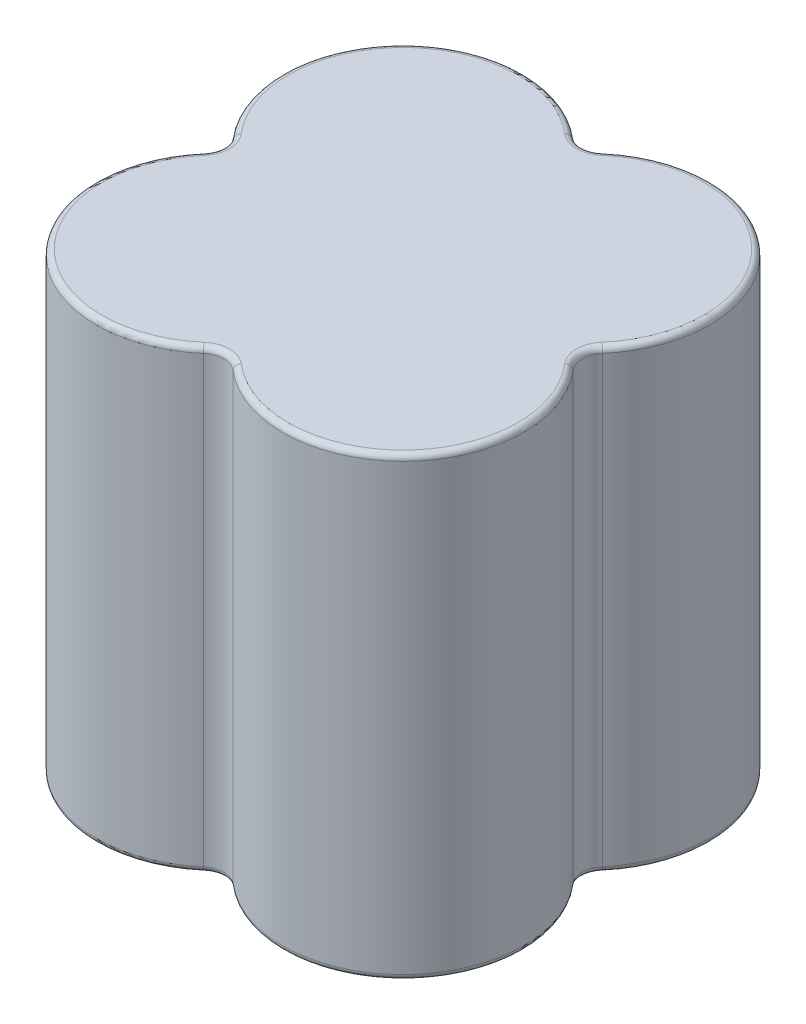
ISO-10303-21;
HEADER;
FILE_DESCRIPTION(('STEP AP214'),'2;1');
FILE_NAME('part.step','',(''),(''),'','','');
FILE_SCHEMA(('AUTOMOTIVE_DESIGN { 1 0 10303 214 1 1 1 1 }'));
ENDSEC;
DATA;
#1=APPLICATION_CONTEXT('core data for automotive mechanical design processes');
#2=APPLICATION_PROTOCOL_DEFINITION('international standard','automotive_design',2000,#1);
#3=PRODUCT_CONTEXT('',#1,'mechanical');
#4=PRODUCT('Part','Part','',(#3));
#5=PRODUCT_RELATED_PRODUCT_CATEGORY('part','',(#4));
#6=PRODUCT_DEFINITION_FORMATION('','',#4);
#7=PRODUCT_DEFINITION_CONTEXT('part definition',#1,'design');
#8=PRODUCT_DEFINITION('design','',#6,#7);
#9=PRODUCT_DEFINITION_SHAPE('','',#8);
#10=(LENGTH_UNIT() NAMED_UNIT(*) SI_UNIT(.MILLI.,.METRE.));
#11=(NAMED_UNIT(*) PLANE_ANGLE_UNIT() SI_UNIT($,.RADIAN.));
#12=(NAMED_UNIT(*) SI_UNIT($,.STERADIAN.) SOLID_ANGLE_UNIT());
#13=UNCERTAINTY_MEASURE_WITH_UNIT(LENGTH_MEASURE(1.E-05),#10,'distance_accuracy_value','');
#14=(GEOMETRIC_REPRESENTATION_CONTEXT(3) GLOBAL_UNCERTAINTY_ASSIGNED_CONTEXT((#13)) GLOBAL_UNIT_ASSIGNED_CONTEXT((#10,
#11,#12)) REPRESENTATION_CONTEXT('',''));
#15=CARTESIAN_POINT('',(0.,0.,0.));
#16=DIRECTION('',(0.,0.,1.));
#17=DIRECTION('',(1.,0.,0.));
#18=AXIS2_PLACEMENT_3D('',#15,#16,#17);
#19=CARTESIAN_POINT('',(-0.00483302377669213,40.,-17.7219559383546));
#20=DIRECTION('',(0.,-1.,0.));
#21=DIRECTION('',(0.,0.,-1.));
#22=AXIS2_PLACEMENT_3D('',#19,#20,#21);
#23=CYLINDRICAL_SURFACE('',#22,1.99999999999999);
#24=DIRECTION('',(0.,-1.,0.));
#25=VECTOR('',#24,1.);
#26=CARTESIAN_POINT('',(1.29727201579494,40.,-16.203890568905));
#27=LINE('',#26,#25);
#28=CARTESIAN_POINT('',(1.29727201579494,39.5,-16.203890568905));
#29=VERTEX_POINT('',#28);
#30=CARTESIAN_POINT('',(1.29727201579494,0.5,-16.203890568905));
#31=VERTEX_POINT('',#30);
#32=EDGE_CURVE('E241',#29,#31,#27,.T.);
#33=ORIENTED_EDGE('',*,*,#32,.T.);
#34=CARTESIAN_POINT('',(-0.00483302377669213,0.5,-17.7219559383546));
#35=DIRECTION('',(0.,1.,0.));
#36=DIRECTION('',(0.,0.,1.));
#37=AXIS2_PLACEMENT_3D('',#34,#35,#36);
#38=CIRCLE('',#37,1.99999999999999);
#39=CARTESIAN_POINT('',(-1.30610989349822,0.5,-16.2031806066061));
#40=VERTEX_POINT('',#39);
#41=EDGE_CURVE('E178',#31,#40,#38,.F.);
#42=ORIENTED_EDGE('',*,*,#41,.T.);
#43=DIRECTION('',(0.,-1.,0.));
#44=VECTOR('',#43,1.);
#45=CARTESIAN_POINT('',(-1.30610989349822,40.,-16.2031806066061));
#46=LINE('',#45,#44);
#47=CARTESIAN_POINT('',(-1.30610989349822,39.5,-16.2031806066061));
#48=VERTEX_POINT('',#47);
#49=EDGE_CURVE('E162',#48,#40,#46,.T.);
#50=ORIENTED_EDGE('',*,*,#49,.F.);
#51=CARTESIAN_POINT('',(-0.00483302377669213,39.5,-17.7219559383546));
#52=DIRECTION('',(0.,1.,0.));
#53=DIRECTION('',(0.,0.,1.));
#54=AXIS2_PLACEMENT_3D('',#51,#52,#53);
#55=CIRCLE('',#54,1.99999999999999);
#56=EDGE_CURVE('E175',#48,#29,#55,.T.);
#57=ORIENTED_EDGE('',*,*,#56,.T.);
#58=EDGE_LOOP('',(#33,#42,#50,#57));
#59=FACE_BOUND('',#58,.T.);
#60=ADVANCED_FACE('F43',(#59),#23,.F.);
#61=CARTESIAN_POINT('',(-8.18223055466842,40.,-8.17776904254259));
#62=DIRECTION('',(0.,-1.,0.));
#63=DIRECTION('',(0.,0.,-1.));
#64=AXIS2_PLACEMENT_3D('',#61,#62,#63);
#65=CYLINDRICAL_SURFACE('',#64,10.5682669402119);
#66=ORIENTED_EDGE('',*,*,#49,.T.);
#67=CARTESIAN_POINT('',(-8.18223055466842,0.5,-8.17776904254259));
#68=DIRECTION('',(0.,1.,0.));
#69=DIRECTION('',(0.,0.,1.));
#70=AXIS2_PLACEMENT_3D('',#67,#68,#69);
#71=CIRCLE('',#70,10.5682669402119);
#72=CARTESIAN_POINT('',(-16.2038905831857,0.5,-1.29727222134837));
#73=VERTEX_POINT('',#72);
#74=EDGE_CURVE('E168',#40,#73,#71,.T.);
#75=ORIENTED_EDGE('',*,*,#74,.T.);
#76=DIRECTION('',(0.,-1.,0.));
#77=VECTOR('',#76,1.);
#78=CARTESIAN_POINT('',(-16.2038905831857,40.,-1.29727222134837));
#79=LINE('',#78,#77);
#80=CARTESIAN_POINT('',(-16.2038905831857,39.5,-1.29727222134837));
#81=VERTEX_POINT('',#80);
#82=EDGE_CURVE('E164',#81,#73,#79,.T.);
#83=ORIENTED_EDGE('',*,*,#82,.F.);
#84=CARTESIAN_POINT('',(-8.18223055466842,39.5,-8.17776904254259));
#85=DIRECTION('',(0.,1.,0.));
#86=DIRECTION('',(0.,0.,1.));
#87=AXIS2_PLACEMENT_3D('',#84,#85,#86);
#88=CIRCLE('',#87,10.5682669402119);
#89=EDGE_CURVE('E159',#81,#48,#88,.F.);
#90=ORIENTED_EDGE('',*,*,#89,.T.);
#91=EDGE_LOOP('',(#66,#75,#83,#90));
#92=FACE_BOUND('',#91,.T.);
#93=ADVANCED_FACE('F161',(#92),#65,.T.);
#94=CARTESIAN_POINT('',(-17.7219559526353,40.,0.00483281822328188));
#95=DIRECTION('',(0.,-1.,0.));
#96=DIRECTION('',(0.,0.,-1.));
#97=AXIS2_PLACEMENT_3D('',#94,#95,#96);
#98=CYLINDRICAL_SURFACE('',#97,2.);
#99=ORIENTED_EDGE('',*,*,#82,.T.);
#100=CARTESIAN_POINT('',(-17.7219559526353,0.5,0.00483281822328188));
#101=DIRECTION('',(0.,1.,0.));
#102=DIRECTION('',(0.,0.,1.));
#103=AXIS2_PLACEMENT_3D('',#100,#101,#102);
#104=CIRCLE('',#103,2.);
#105=CARTESIAN_POINT('',(-16.2031806208868,0.5,1.3061096879448));
#106=VERTEX_POINT('',#105);
#107=EDGE_CURVE('E285',#73,#106,#104,.F.);
#108=ORIENTED_EDGE('',*,*,#107,.T.);
#109=DIRECTION('',(0.,-1.,0.));
#110=VECTOR('',#109,1.);
#111=CARTESIAN_POINT('',(-16.2031806208868,40.,1.3061096879448));
#112=LINE('',#111,#110);
#113=CARTESIAN_POINT('',(-16.2031806208868,39.5,1.3061096879448));
#114=VERTEX_POINT('',#113);
#115=EDGE_CURVE('E261',#114,#106,#112,.T.);
#116=ORIENTED_EDGE('',*,*,#115,.F.);
#117=CARTESIAN_POINT('',(-17.7219559526353,39.5,0.00483281822328188));
#118=DIRECTION('',(0.,1.,0.));
#119=DIRECTION('',(0.,0.,1.));
#120=AXIS2_PLACEMENT_3D('',#117,#118,#119);
#121=CIRCLE('',#120,2.);
#122=EDGE_CURVE('E283',#114,#81,#121,.T.);
#123=ORIENTED_EDGE('',*,*,#122,.T.);
#124=EDGE_LOOP('',(#99,#108,#116,#123));
#125=FACE_BOUND('',#124,.T.);
#126=ADVANCED_FACE('F327',(#125),#98,.F.);
#127=CARTESIAN_POINT('',(-8.1777690568233,40.,8.18223034911501));
#128=DIRECTION('',(0.,-1.,0.));
#129=DIRECTION('',(0.,0.,-1.));
#130=AXIS2_PLACEMENT_3D('',#127,#128,#129);
#131=CYLINDRICAL_SURFACE('',#130,10.5682669402119);
#132=ORIENTED_EDGE('',*,*,#115,.T.);
#133=CARTESIAN_POINT('',(-8.1777690568233,0.5,8.18223034911501));
#134=DIRECTION('',(0.,1.,0.));
#135=DIRECTION('',(0.,0.,1.));
#136=AXIS2_PLACEMENT_3D('',#133,#134,#135);
#137=CIRCLE('',#136,10.5682669402119);
#138=CARTESIAN_POINT('',(-1.29727223562908,0.5,16.2038903776323));
#139=VERTEX_POINT('',#138);
#140=EDGE_CURVE('E289',#106,#139,#137,.T.);
#141=ORIENTED_EDGE('',*,*,#140,.T.);
#142=DIRECTION('',(0.,-1.,0.));
#143=VECTOR('',#142,1.);
#144=CARTESIAN_POINT('',(-1.29727223562908,40.,16.2038903776323));
#145=LINE('',#144,#143);
#146=CARTESIAN_POINT('',(-1.29727223562908,39.5,16.2038903776323));
#147=VERTEX_POINT('',#146);
#148=EDGE_CURVE('E258',#147,#139,#145,.T.);
#149=ORIENTED_EDGE('',*,*,#148,.F.);
#150=CARTESIAN_POINT('',(-8.1777690568233,39.5,8.18223034911501));
#151=DIRECTION('',(0.,1.,0.));
#152=DIRECTION('',(0.,0.,1.));
#153=AXIS2_PLACEMENT_3D('',#150,#151,#152);
#154=CIRCLE('',#153,10.5682669402119);
#155=EDGE_CURVE('E287',#147,#114,#154,.F.);
#156=ORIENTED_EDGE('',*,*,#155,.T.);
#157=EDGE_LOOP('',(#132,#141,#149,#156));
#158=FACE_BOUND('',#157,.T.);
#159=ADVANCED_FACE('F330',(#158),#131,.T.);
#160=CARTESIAN_POINT('',(0.00483280394257962,40.,17.7219557470819));
#161=DIRECTION('',(0.,-1.,0.));
#162=DIRECTION('',(0.,0.,-1.));
#163=AXIS2_PLACEMENT_3D('',#160,#161,#162);
#164=CYLINDRICAL_SURFACE('',#163,2.);
#165=ORIENTED_EDGE('',*,*,#148,.T.);
#166=CARTESIAN_POINT('',(0.00483280394257962,0.5,17.7219557470819));
#167=DIRECTION('',(0.,1.,0.));
#168=DIRECTION('',(0.,0.,1.));
#169=AXIS2_PLACEMENT_3D('',#166,#167,#168);
#170=CIRCLE('',#169,2.);
#171=CARTESIAN_POINT('',(1.3061096736641,0.5,16.2031804153334));
#172=VERTEX_POINT('',#171);
#173=EDGE_CURVE('E293',#139,#172,#170,.F.);
#174=ORIENTED_EDGE('',*,*,#173,.T.);
#175=DIRECTION('',(0.,-1.,0.));
#176=VECTOR('',#175,1.);
#177=CARTESIAN_POINT('',(1.3061096736641,40.,16.2031804153334));
#178=LINE('',#177,#176);
#179=CARTESIAN_POINT('',(1.3061096736641,39.5,16.2031804153334));
#180=VERTEX_POINT('',#179);
#181=EDGE_CURVE('E255',#180,#172,#178,.T.);
#182=ORIENTED_EDGE('',*,*,#181,.F.);
#183=CARTESIAN_POINT('',(0.00483280394257962,39.5,17.7219557470819));
#184=DIRECTION('',(0.,1.,0.));
#185=DIRECTION('',(0.,0.,1.));
#186=AXIS2_PLACEMENT_3D('',#183,#184,#185);
#187=CIRCLE('',#186,2.);
#188=EDGE_CURVE('E291',#180,#147,#187,.T.);
#189=ORIENTED_EDGE('',*,*,#188,.T.);
#190=EDGE_LOOP('',(#165,#174,#182,#189));
#191=FACE_BOUND('',#190,.T.);
#192=ADVANCED_FACE('F347',(#191),#164,.F.);
#193=CARTESIAN_POINT('',(8.18223033483431,40.,8.1777688512699));
#194=DIRECTION('',(0.,-1.,0.));
#195=DIRECTION('',(0.,0.,-1.));
#196=AXIS2_PLACEMENT_3D('',#193,#194,#195);
#197=CYLINDRICAL_SURFACE('',#196,10.5682669402119);
#198=ORIENTED_EDGE('',*,*,#181,.T.);
#199=CARTESIAN_POINT('',(8.18223033483431,0.5,8.1777688512699));
#200=DIRECTION('',(0.,1.,0.));
#201=DIRECTION('',(0.,0.,1.));
#202=AXIS2_PLACEMENT_3D('',#199,#200,#201);
#203=CIRCLE('',#202,10.5682669402119);
#204=CARTESIAN_POINT('',(16.2038903633516,0.5,1.29727203007568));
#205=VERTEX_POINT('',#204);
#206=EDGE_CURVE('E297',#172,#205,#203,.T.);
#207=ORIENTED_EDGE('',*,*,#206,.T.);
#208=DIRECTION('',(0.,-1.,0.));
#209=VECTOR('',#208,1.);
#210=CARTESIAN_POINT('',(16.2038903633516,40.,1.29727203007568));
#211=LINE('',#210,#209);
#212=CARTESIAN_POINT('',(16.2038903633516,39.5,1.29727203007568));
#213=VERTEX_POINT('',#212);
#214=EDGE_CURVE('E250',#213,#205,#211,.T.);
#215=ORIENTED_EDGE('',*,*,#214,.F.);
#216=CARTESIAN_POINT('',(8.18223033483431,39.5,8.1777688512699));
#217=DIRECTION('',(0.,1.,0.));
#218=DIRECTION('',(0.,0.,1.));
#219=AXIS2_PLACEMENT_3D('',#216,#217,#218);
#220=CIRCLE('',#219,10.5682669402119);
#221=EDGE_CURVE('E295',#213,#180,#220,.F.);
#222=ORIENTED_EDGE('',*,*,#221,.T.);
#223=EDGE_LOOP('',(#198,#207,#215,#222));
#224=FACE_BOUND('',#223,.T.);
#225=ADVANCED_FACE('F350',(#224),#197,.T.);
#226=CARTESIAN_POINT('',(17.7219557328012,40.,-0.00483300949597946));
#227=DIRECTION('',(0.,-1.,0.));
#228=DIRECTION('',(0.,0.,-1.));
#229=AXIS2_PLACEMENT_3D('',#226,#227,#228);
#230=CYLINDRICAL_SURFACE('',#229,2.);
#231=ORIENTED_EDGE('',*,*,#214,.T.);
#232=CARTESIAN_POINT('',(17.7219557328012,0.5,-0.00483300949597946));
#233=DIRECTION('',(0.,1.,0.));
#234=DIRECTION('',(0.,0.,1.));
#235=AXIS2_PLACEMENT_3D('',#232,#233,#234);
#236=CIRCLE('',#235,2.);
#237=CARTESIAN_POINT('',(16.2031804010527,0.5,-1.3061098792175));
#238=VERTEX_POINT('',#237);
#239=EDGE_CURVE('E301',#205,#238,#236,.F.);
#240=ORIENTED_EDGE('',*,*,#239,.T.);
#241=DIRECTION('',(0.,-1.,0.));
#242=VECTOR('',#241,1.);
#243=CARTESIAN_POINT('',(16.2031804010527,40.,-1.3061098792175));
#244=LINE('',#243,#242);
#245=CARTESIAN_POINT('',(16.2031804010527,39.5,-1.3061098792175));
#246=VERTEX_POINT('',#245);
#247=EDGE_CURVE('E246',#246,#238,#244,.T.);
#248=ORIENTED_EDGE('',*,*,#247,.F.);
#249=CARTESIAN_POINT('',(17.7219557328012,39.5,-0.00483300949597946));
#250=DIRECTION('',(0.,1.,0.));
#251=DIRECTION('',(0.,0.,1.));
#252=AXIS2_PLACEMENT_3D('',#249,#250,#251);
#253=CIRCLE('',#252,2.);
#254=EDGE_CURVE('E299',#246,#213,#253,.T.);
#255=ORIENTED_EDGE('',*,*,#254,.T.);
#256=EDGE_LOOP('',(#231,#240,#248,#255));
#257=FACE_BOUND('',#256,.T.);
#258=ADVANCED_FACE('F516',(#257),#230,.F.);
#259=CARTESIAN_POINT('',(8.17776883698918,40.,-8.18223054038771));
#260=DIRECTION('',(0.,-1.,0.));
#261=DIRECTION('',(0.,0.,-1.));
#262=AXIS2_PLACEMENT_3D('',#259,#260,#261);
#263=CYLINDRICAL_SURFACE('',#262,10.5682669402119);
#264=ORIENTED_EDGE('',*,*,#247,.T.);
#265=CARTESIAN_POINT('',(8.17776883698918,0.5,-8.18223054038771));
#266=DIRECTION('',(0.,1.,0.));
#267=DIRECTION('',(0.,0.,1.));
#268=AXIS2_PLACEMENT_3D('',#265,#266,#267);
#269=CIRCLE('',#268,10.5682669402119);
#270=EDGE_CURVE('E305',#238,#31,#269,.T.);
#271=ORIENTED_EDGE('',*,*,#270,.T.);
#272=ORIENTED_EDGE('',*,*,#32,.F.);
#273=CARTESIAN_POINT('',(8.17776883698918,39.5,-8.18223054038771));
#274=DIRECTION('',(0.,1.,0.));
#275=DIRECTION('',(0.,0.,1.));
#276=AXIS2_PLACEMENT_3D('',#273,#274,#275);
#277=CIRCLE('',#276,10.5682669402119);
#278=EDGE_CURVE('E303',#29,#246,#277,.F.);
#279=ORIENTED_EDGE('',*,*,#278,.T.);
#280=EDGE_LOOP('',(#264,#271,#272,#279));
#281=FACE_BOUND('',#280,.T.);
#282=ADVANCED_FACE('F508',(#281),#263,.T.);
#283=CARTESIAN_POINT('',(4.08646790660625,40.,-12.9520932393712));
#284=DIRECTION('',(0.,1.,0.));
#285=DIRECTION('',(0.,0.,1.));
#286=AXIS2_PLACEMENT_3D('',#283,#284,#285);
#287=PLANE('',#286);
#288=CARTESIAN_POINT('',(8.17776883698918,40.,-8.18223054038771));
#289=DIRECTION('',(0.,1.,0.));
#290=DIRECTION('',(0.,0.,1.));
#291=AXIS2_PLACEMENT_3D('',#288,#289,#290);
#292=CIRCLE('',#291,10.0682669402119);
#293=CARTESIAN_POINT('',(15.8234865681156,40.,-1.63142909664788));
#294=VERTEX_POINT('',#293);
#295=CARTESIAN_POINT('',(1.62279827568785,40.,-15.8243742265426));
#296=VERTEX_POINT('',#295);
#297=EDGE_CURVE('E307',#294,#296,#292,.T.);
#298=ORIENTED_EDGE('',*,*,#297,.T.);
#299=CARTESIAN_POINT('',(-0.00483302377669213,40.,-17.7219559383546));
#300=DIRECTION('',(0.,1.,0.));
#301=DIRECTION('',(0.,0.,1.));
#302=AXIS2_PLACEMENT_3D('',#299,#300,#301);
#303=CIRCLE('',#302,2.49999999999999);
#304=CARTESIAN_POINT('',(-1.6314291109286,40.,-15.823486773669));
#305=VERTEX_POINT('',#304);
#306=EDGE_CURVE('E11',#296,#305,#303,.F.);
#307=ORIENTED_EDGE('',*,*,#306,.T.);
#308=CARTESIAN_POINT('',(-8.18223055466842,40.,-8.17776904254259));
#309=DIRECTION('',(0.,1.,0.));
#310=DIRECTION('',(0.,0.,1.));
#311=AXIS2_PLACEMENT_3D('',#308,#309,#310);
#312=CIRCLE('',#311,10.0682669402119);
#313=CARTESIAN_POINT('',(-15.8243742408233,40.,-1.62279848124129));
#314=VERTEX_POINT('',#313);
#315=EDGE_CURVE('E52',#305,#314,#312,.T.);
#316=ORIENTED_EDGE('',*,*,#315,.T.);
#317=CARTESIAN_POINT('',(-17.7219559526353,40.,0.00483281822328188));
#318=DIRECTION('',(0.,1.,0.));
#319=DIRECTION('',(0.,0.,1.));
#320=AXIS2_PLACEMENT_3D('',#317,#318,#319);
#321=CIRCLE('',#320,2.5);
#322=CARTESIAN_POINT('',(-15.8234867879497,40.,1.63142890537518));
#323=VERTEX_POINT('',#322);
#324=EDGE_CURVE('E317',#314,#323,#321,.F.);
#325=ORIENTED_EDGE('',*,*,#324,.T.);
#326=CARTESIAN_POINT('',(-8.1777690568233,40.,8.18223034911501));
#327=DIRECTION('',(0.,1.,0.));
#328=DIRECTION('',(0.,0.,1.));
#329=AXIS2_PLACEMENT_3D('',#326,#327,#328);
#330=CIRCLE('',#329,10.0682669402119);
#331=CARTESIAN_POINT('',(-1.62279849552199,40.,15.8243740352699));
#332=VERTEX_POINT('',#331);
#333=EDGE_CURVE('E315',#323,#332,#330,.T.);
#334=ORIENTED_EDGE('',*,*,#333,.T.);
#335=CARTESIAN_POINT('',(0.00483280394257962,40.,17.7219557470819));
#336=DIRECTION('',(0.,1.,0.));
#337=DIRECTION('',(0.,0.,1.));
#338=AXIS2_PLACEMENT_3D('',#335,#336,#337);
#339=CIRCLE('',#338,2.5);
#340=CARTESIAN_POINT('',(1.63142889109449,40.,15.8234865823963));
#341=VERTEX_POINT('',#340);
#342=EDGE_CURVE('E313',#332,#341,#339,.F.);
#343=ORIENTED_EDGE('',*,*,#342,.T.);
#344=CARTESIAN_POINT('',(8.18223033483431,40.,8.1777688512699));
#345=DIRECTION('',(0.,1.,0.));
#346=DIRECTION('',(0.,0.,1.));
#347=AXIS2_PLACEMENT_3D('',#344,#345,#346);
#348=CIRCLE('',#347,10.0682669402119);
#349=CARTESIAN_POINT('',(15.8243740209892,40.,1.62279828996859));
#350=VERTEX_POINT('',#349);
#351=EDGE_CURVE('E311',#341,#350,#348,.T.);
#352=ORIENTED_EDGE('',*,*,#351,.T.);
#353=CARTESIAN_POINT('',(17.7219557328012,40.,-0.00483300949597946));
#354=DIRECTION('',(0.,1.,0.));
#355=DIRECTION('',(0.,0.,1.));
#356=AXIS2_PLACEMENT_3D('',#353,#354,#355);
#357=CIRCLE('',#356,2.5);
#358=EDGE_CURVE('E309',#350,#294,#357,.F.);
#359=ORIENTED_EDGE('',*,*,#358,.T.);
#360=EDGE_LOOP('',(#298,#307,#316,#325,#334,#343,#352,#359));
#361=FACE_BOUND('',#360,.T.);
#362=ADVANCED_FACE('F318',(#361),#287,.T.);
#363=CARTESIAN_POINT('',(4.08646790660625,0.,-12.9520932393712));
#364=DIRECTION('',(0.,1.,0.));
#365=DIRECTION('',(0.,0.,1.));
#366=AXIS2_PLACEMENT_3D('',#363,#364,#365);
#367=PLANE('',#366);
#368=CARTESIAN_POINT('',(-8.18223055466842,0.,-8.17776904254259));
#369=DIRECTION('',(0.,1.,0.));
#370=DIRECTION('',(0.,0.,1.));
#371=AXIS2_PLACEMENT_3D('',#368,#369,#370);
#372=CIRCLE('',#371,10.0682669402119);
#373=CARTESIAN_POINT('',(-15.8243742408233,0.,-1.62279848124129));
#374=VERTEX_POINT('',#373);
#375=CARTESIAN_POINT('',(-1.63142911092861,0.,-15.823486773669));
#376=VERTEX_POINT('',#375);
#377=EDGE_CURVE('E278',#374,#376,#372,.F.);
#378=ORIENTED_EDGE('',*,*,#377,.T.);
#379=CARTESIAN_POINT('',(-0.00483302377669213,0.,-17.7219559383546));
#380=DIRECTION('',(0.,1.,0.));
#381=DIRECTION('',(0.,0.,1.));
#382=AXIS2_PLACEMENT_3D('',#379,#380,#381);
#383=CIRCLE('',#382,2.49999999999999);
#384=CARTESIAN_POINT('',(1.62279827568785,0.,-15.8243742265426));
#385=VERTEX_POINT('',#384);
#386=EDGE_CURVE('E169',#376,#385,#383,.T.);
#387=ORIENTED_EDGE('',*,*,#386,.T.);
#388=CARTESIAN_POINT('',(8.17776883698918,0.,-8.18223054038771));
#389=DIRECTION('',(0.,1.,0.));
#390=DIRECTION('',(0.,0.,1.));
#391=AXIS2_PLACEMENT_3D('',#388,#389,#390);
#392=CIRCLE('',#391,10.0682669402119);
#393=CARTESIAN_POINT('',(15.8234865681156,0.,-1.63142909664788));
#394=VERTEX_POINT('',#393);
#395=EDGE_CURVE('E266',#385,#394,#392,.F.);
#396=ORIENTED_EDGE('',*,*,#395,.T.);
#397=CARTESIAN_POINT('',(17.7219557328012,0.,-0.00483300949597946));
#398=DIRECTION('',(0.,1.,0.));
#399=DIRECTION('',(0.,0.,1.));
#400=AXIS2_PLACEMENT_3D('',#397,#398,#399);
#401=CIRCLE('',#400,2.5);
#402=CARTESIAN_POINT('',(15.8243740209892,0.,1.62279828996859));
#403=VERTEX_POINT('',#402);
#404=EDGE_CURVE('E268',#394,#403,#401,.T.);
#405=ORIENTED_EDGE('',*,*,#404,.T.);
#406=CARTESIAN_POINT('',(8.18223033483431,0.,8.1777688512699));
#407=DIRECTION('',(0.,1.,0.));
#408=DIRECTION('',(0.,0.,1.));
#409=AXIS2_PLACEMENT_3D('',#406,#407,#408);
#410=CIRCLE('',#409,10.0682669402119);
#411=CARTESIAN_POINT('',(1.63142889109449,0.,15.8234865823963));
#412=VERTEX_POINT('',#411);
#413=EDGE_CURVE('E270',#403,#412,#410,.F.);
#414=ORIENTED_EDGE('',*,*,#413,.T.);
#415=CARTESIAN_POINT('',(0.00483280394257962,0.,17.7219557470819));
#416=DIRECTION('',(0.,1.,0.));
#417=DIRECTION('',(0.,0.,1.));
#418=AXIS2_PLACEMENT_3D('',#415,#416,#417);
#419=CIRCLE('',#418,2.5);
#420=CARTESIAN_POINT('',(-1.62279849552199,0.,15.8243740352699));
#421=VERTEX_POINT('',#420);
#422=EDGE_CURVE('E272',#412,#421,#419,.T.);
#423=ORIENTED_EDGE('',*,*,#422,.T.);
#424=CARTESIAN_POINT('',(-8.1777690568233,0.,8.18223034911501));
#425=DIRECTION('',(0.,1.,0.));
#426=DIRECTION('',(0.,0.,1.));
#427=AXIS2_PLACEMENT_3D('',#424,#425,#426);
#428=CIRCLE('',#427,10.0682669402119);
#429=CARTESIAN_POINT('',(-15.8234867879497,0.,1.63142890537518));
#430=VERTEX_POINT('',#429);
#431=EDGE_CURVE('E274',#421,#430,#428,.F.);
#432=ORIENTED_EDGE('',*,*,#431,.T.);
#433=CARTESIAN_POINT('',(-17.7219559526353,0.,0.00483281822328188));
#434=DIRECTION('',(0.,1.,0.));
#435=DIRECTION('',(0.,0.,1.));
#436=AXIS2_PLACEMENT_3D('',#433,#434,#435);
#437=CIRCLE('',#436,2.5);
#438=EDGE_CURVE('E276',#430,#374,#437,.T.);
#439=ORIENTED_EDGE('',*,*,#438,.T.);
#440=EDGE_LOOP('',(#378,#387,#396,#405,#414,#423,#432,#439));
#441=FACE_BOUND('',#440,.T.);
#442=ADVANCED_FACE('F340',(#441),#367,.F.);
#443=CARTESIAN_POINT('',(0.00483280394257962,0.5,17.7219557470819));
#444=DIRECTION('',(0.,1.,0.));
#445=DIRECTION('',(0.,0.,1.));
#446=AXIS2_PLACEMENT_3D('',#443,#444,#445);
#447=TOROIDAL_SURFACE('',#446,2.5,0.5);
#448=CARTESIAN_POINT('',(-1.62279849552199,0.5,15.8243740352699));
#449=DIRECTION('',(-0.759032684724791,0.,0.651052519785828));
#450=DIRECTION('',(0.651052519785828,0.,0.759032684724791));
#451=AXIS2_PLACEMENT_3D('',#448,#449,#450);
#452=CIRCLE('',#451,0.5);
#453=EDGE_CURVE('E234',#421,#139,#452,.T.);
#454=ORIENTED_EDGE('',*,*,#453,.F.);
#455=ORIENTED_EDGE('',*,*,#422,.F.);
#456=CARTESIAN_POINT('',(1.63142889109448,0.5,15.8234865823963));
#457=DIRECTION('',(0.759387665874246,0.,0.650638434860764));
#458=DIRECTION('',(0.650638434860764,0.,-0.759387665874246));
#459=AXIS2_PLACEMENT_3D('',#456,#457,#458);
#460=CIRCLE('',#459,0.5);
#461=EDGE_CURVE('E190',#172,#412,#460,.T.);
#462=ORIENTED_EDGE('',*,*,#461,.F.);
#463=ORIENTED_EDGE('',*,*,#173,.F.);
#464=EDGE_LOOP('',(#454,#455,#462,#463));
#465=FACE_BOUND('',#464,.T.);
#466=ADVANCED_FACE('F344',(#465),#447,.T.);
#467=CARTESIAN_POINT('',(8.18223033483431,0.5,8.1777688512699));
#468=DIRECTION('',(0.,1.,0.));
#469=DIRECTION('',(0.,0.,1.));
#470=AXIS2_PLACEMENT_3D('',#467,#468,#469);
#471=TOROIDAL_SURFACE('',#470,10.0682669402119,0.5);
#472=ORIENTED_EDGE('',*,*,#461,.T.);
#473=ORIENTED_EDGE('',*,*,#413,.F.);
#474=CARTESIAN_POINT('',(15.8243740209892,0.5,1.62279828996859));
#475=DIRECTION('',(-0.651052519785828,0.,-0.759032684724791));
#476=DIRECTION('',(-0.759032684724791,0.,0.651052519785828));
#477=AXIS2_PLACEMENT_3D('',#474,#475,#476);
#478=CIRCLE('',#477,0.5);
#479=EDGE_CURVE('E232',#205,#403,#478,.T.);
#480=ORIENTED_EDGE('',*,*,#479,.F.);
#481=ORIENTED_EDGE('',*,*,#206,.F.);
#482=EDGE_LOOP('',(#472,#473,#480,#481));
#483=FACE_BOUND('',#482,.T.);
#484=ADVANCED_FACE('F392',(#483),#471,.T.);
#485=CARTESIAN_POINT('',(-8.1777690568233,0.5,8.18223034911501));
#486=DIRECTION('',(0.,1.,0.));
#487=DIRECTION('',(0.,0.,1.));
#488=AXIS2_PLACEMENT_3D('',#485,#486,#487);
#489=TOROIDAL_SURFACE('',#488,10.0682669402119,0.5);
#490=ORIENTED_EDGE('',*,*,#453,.T.);
#491=ORIENTED_EDGE('',*,*,#140,.F.);
#492=CARTESIAN_POINT('',(-15.8234867879497,0.5,1.63142890537518));
#493=DIRECTION('',(0.650638434860758,0.,-0.759387665874251));
#494=DIRECTION('',(-0.759387665874251,0.,-0.650638434860758));
#495=AXIS2_PLACEMENT_3D('',#492,#493,#494);
#496=CIRCLE('',#495,0.5);
#497=EDGE_CURVE('E229',#430,#106,#496,.T.);
#498=ORIENTED_EDGE('',*,*,#497,.F.);
#499=ORIENTED_EDGE('',*,*,#431,.F.);
#500=EDGE_LOOP('',(#490,#491,#498,#499));
#501=FACE_BOUND('',#500,.T.);
#502=ADVANCED_FACE('F333',(#501),#489,.T.);
#503=CARTESIAN_POINT('',(17.7219557328012,0.5,-0.00483300949597946));
#504=DIRECTION('',(0.,1.,0.));
#505=DIRECTION('',(0.,0.,1.));
#506=AXIS2_PLACEMENT_3D('',#503,#504,#505);
#507=TOROIDAL_SURFACE('',#506,2.5,0.5);
#508=ORIENTED_EDGE('',*,*,#479,.T.);
#509=ORIENTED_EDGE('',*,*,#404,.F.);
#510=CARTESIAN_POINT('',(15.8234865681156,0.5,-1.63142909664788));
#511=DIRECTION('',(0.650638434860759,0.,-0.75938766587425));
#512=DIRECTION('',(-0.75938766587425,0.,-0.650638434860759));
#513=AXIS2_PLACEMENT_3D('',#510,#511,#512);
#514=CIRCLE('',#513,0.5);
#515=EDGE_CURVE('E226',#238,#394,#514,.T.);
#516=ORIENTED_EDGE('',*,*,#515,.F.);
#517=ORIENTED_EDGE('',*,*,#239,.F.);
#518=EDGE_LOOP('',(#508,#509,#516,#517));
#519=FACE_BOUND('',#518,.T.);
#520=ADVANCED_FACE('F386',(#519),#507,.T.);
#521=CARTESIAN_POINT('',(-17.7219559526353,0.5,0.00483281822328188));
#522=DIRECTION('',(0.,1.,0.));
#523=DIRECTION('',(0.,0.,1.));
#524=AXIS2_PLACEMENT_3D('',#521,#522,#523);
#525=TOROIDAL_SURFACE('',#524,2.5,0.5);
#526=ORIENTED_EDGE('',*,*,#497,.T.);
#527=ORIENTED_EDGE('',*,*,#107,.F.);
#528=CARTESIAN_POINT('',(-15.8243742408233,0.5,-1.62279848124129));
#529=DIRECTION('',(-0.651052519785828,0.,-0.759032684724791));
#530=DIRECTION('',(-0.759032684724791,0.,0.651052519785828));
#531=AXIS2_PLACEMENT_3D('',#528,#529,#530);
#532=CIRCLE('',#531,0.5);
#533=EDGE_CURVE('E220',#374,#73,#532,.T.);
#534=ORIENTED_EDGE('',*,*,#533,.F.);
#535=ORIENTED_EDGE('',*,*,#438,.F.);
#536=EDGE_LOOP('',(#526,#527,#534,#535));
#537=FACE_BOUND('',#536,.T.);
#538=ADVANCED_FACE('F336',(#537),#525,.T.);
#539=CARTESIAN_POINT('',(8.17776883698918,0.5,-8.18223054038771));
#540=DIRECTION('',(0.,1.,0.));
#541=DIRECTION('',(0.,0.,1.));
#542=AXIS2_PLACEMENT_3D('',#539,#540,#541);
#543=TOROIDAL_SURFACE('',#542,10.0682669402119,0.5);
#544=ORIENTED_EDGE('',*,*,#515,.T.);
#545=ORIENTED_EDGE('',*,*,#395,.F.);
#546=CARTESIAN_POINT('',(1.62279827568785,0.5,-15.8243742265426));
#547=DIRECTION('',(-0.75903268472479,0.,0.651052519785829));
#548=DIRECTION('',(0.651052519785829,0.,0.75903268472479));
#549=AXIS2_PLACEMENT_3D('',#546,#547,#548);
#550=CIRCLE('',#549,0.5);
#551=EDGE_CURVE('E214',#31,#385,#550,.T.);
#552=ORIENTED_EDGE('',*,*,#551,.F.);
#553=ORIENTED_EDGE('',*,*,#270,.F.);
#554=EDGE_LOOP('',(#544,#545,#552,#553));
#555=FACE_BOUND('',#554,.T.);
#556=ADVANCED_FACE('F379',(#555),#543,.T.);
#557=CARTESIAN_POINT('',(-8.18223055466842,0.5,-8.17776904254259));
#558=DIRECTION('',(0.,1.,0.));
#559=DIRECTION('',(0.,0.,1.));
#560=AXIS2_PLACEMENT_3D('',#557,#558,#559);
#561=TOROIDAL_SURFACE('',#560,10.0682669402119,0.5);
#562=ORIENTED_EDGE('',*,*,#533,.T.);
#563=ORIENTED_EDGE('',*,*,#74,.F.);
#564=CARTESIAN_POINT('',(-1.63142911092861,0.5,-15.823486773669));
#565=DIRECTION('',(0.759387665874245,0.,0.650638434860765));
#566=DIRECTION('',(0.650638434860766,0.,-0.759387665874245));
#567=AXIS2_PLACEMENT_3D('',#564,#565,#566);
#568=CIRCLE('',#567,0.5);
#569=EDGE_CURVE('E209',#376,#40,#568,.T.);
#570=ORIENTED_EDGE('',*,*,#569,.F.);
#571=ORIENTED_EDGE('',*,*,#377,.F.);
#572=EDGE_LOOP('',(#562,#563,#570,#571));
#573=FACE_BOUND('',#572,.T.);
#574=ADVANCED_FACE('F367',(#573),#561,.T.);
#575=CARTESIAN_POINT('',(-0.00483302377669213,0.5,-17.7219559383546));
#576=DIRECTION('',(0.,1.,0.));
#577=DIRECTION('',(0.,0.,1.));
#578=AXIS2_PLACEMENT_3D('',#575,#576,#577);
#579=TOROIDAL_SURFACE('',#578,2.49999999999999,0.5);
#580=ORIENTED_EDGE('',*,*,#551,.T.);
#581=ORIENTED_EDGE('',*,*,#386,.F.);
#582=ORIENTED_EDGE('',*,*,#569,.T.);
#583=ORIENTED_EDGE('',*,*,#41,.F.);
#584=EDGE_LOOP('',(#580,#581,#582,#583));
#585=FACE_BOUND('',#584,.T.);
#586=ADVANCED_FACE('F362',(#585),#579,.T.);
#587=CARTESIAN_POINT('',(0.00483280394257962,39.5,17.7219557470819));
#588=DIRECTION('',(0.,1.,0.));
#589=DIRECTION('',(0.,0.,1.));
#590=AXIS2_PLACEMENT_3D('',#587,#588,#589);
#591=TOROIDAL_SURFACE('',#590,2.5,0.5);
#592=CARTESIAN_POINT('',(-1.62279849552199,39.5,15.8243740352699));
#593=DIRECTION('',(-0.759032684724791,0.,0.651052519785828));
#594=DIRECTION('',(0.651052519785828,0.,0.759032684724791));
#595=AXIS2_PLACEMENT_3D('',#592,#593,#594);
#596=CIRCLE('',#595,0.5);
#597=EDGE_CURVE('E202',#147,#332,#596,.T.);
#598=ORIENTED_EDGE('',*,*,#597,.F.);
#599=ORIENTED_EDGE('',*,*,#188,.F.);
#600=CARTESIAN_POINT('',(1.63142889109448,39.5,15.8234865823963));
#601=DIRECTION('',(0.759387665874246,0.,0.650638434860764));
#602=DIRECTION('',(0.650638434860764,0.,-0.759387665874246));
#603=AXIS2_PLACEMENT_3D('',#600,#601,#602);
#604=CIRCLE('',#603,0.5);
#605=EDGE_CURVE('E47',#341,#180,#604,.T.);
#606=ORIENTED_EDGE('',*,*,#605,.F.);
#607=ORIENTED_EDGE('',*,*,#342,.F.);
#608=EDGE_LOOP('',(#598,#599,#606,#607));
#609=FACE_BOUND('',#608,.T.);
#610=ADVANCED_FACE('F45',(#609),#591,.T.);
#611=CARTESIAN_POINT('',(8.18223033483431,39.5,8.1777688512699));
#612=DIRECTION('',(0.,1.,0.));
#613=DIRECTION('',(0.,0.,1.));
#614=AXIS2_PLACEMENT_3D('',#611,#612,#613);
#615=TOROIDAL_SURFACE('',#614,10.0682669402119,0.5);
#616=ORIENTED_EDGE('',*,*,#605,.T.);
#617=ORIENTED_EDGE('',*,*,#221,.F.);
#618=CARTESIAN_POINT('',(15.8243740209892,39.5,1.62279828996859));
#619=DIRECTION('',(-0.651052519785828,0.,-0.759032684724791));
#620=DIRECTION('',(-0.759032684724791,0.,0.651052519785828));
#621=AXIS2_PLACEMENT_3D('',#618,#619,#620);
#622=CIRCLE('',#621,0.5);
#623=EDGE_CURVE('E200',#350,#213,#622,.T.);
#624=ORIENTED_EDGE('',*,*,#623,.F.);
#625=ORIENTED_EDGE('',*,*,#351,.F.);
#626=EDGE_LOOP('',(#616,#617,#624,#625));
#627=FACE_BOUND('',#626,.T.);
#628=ADVANCED_FACE('F353',(#627),#615,.T.);
#629=CARTESIAN_POINT('',(-8.1777690568233,39.5,8.18223034911501));
#630=DIRECTION('',(0.,1.,0.));
#631=DIRECTION('',(0.,0.,1.));
#632=AXIS2_PLACEMENT_3D('',#629,#630,#631);
#633=TOROIDAL_SURFACE('',#632,10.0682669402119,0.5);
#634=ORIENTED_EDGE('',*,*,#597,.T.);
#635=ORIENTED_EDGE('',*,*,#333,.F.);
#636=CARTESIAN_POINT('',(-15.8234867879497,39.5,1.63142890537518));
#637=DIRECTION('',(0.650638434860759,0.,-0.75938766587425));
#638=DIRECTION('',(-0.75938766587425,0.,-0.650638434860759));
#639=AXIS2_PLACEMENT_3D('',#636,#637,#638);
#640=CIRCLE('',#639,0.5);
#641=EDGE_CURVE('E197',#114,#323,#640,.T.);
#642=ORIENTED_EDGE('',*,*,#641,.F.);
#643=ORIENTED_EDGE('',*,*,#155,.F.);
#644=EDGE_LOOP('',(#634,#635,#642,#643));
#645=FACE_BOUND('',#644,.T.);
#646=ADVANCED_FACE('F322',(#645),#633,.T.);
#647=CARTESIAN_POINT('',(17.7219557328012,39.5,-0.00483300949597946));
#648=DIRECTION('',(0.,1.,0.));
#649=DIRECTION('',(0.,0.,1.));
#650=AXIS2_PLACEMENT_3D('',#647,#648,#649);
#651=TOROIDAL_SURFACE('',#650,2.5,0.5);
#652=ORIENTED_EDGE('',*,*,#623,.T.);
#653=ORIENTED_EDGE('',*,*,#254,.F.);
#654=CARTESIAN_POINT('',(15.8234865681156,39.5,-1.63142909664788));
#655=DIRECTION('',(0.650638434860759,0.,-0.759387665874251));
#656=DIRECTION('',(-0.759387665874251,0.,-0.650638434860759));
#657=AXIS2_PLACEMENT_3D('',#654,#655,#656);
#658=CIRCLE('',#657,0.5);
#659=EDGE_CURVE('E194',#294,#246,#658,.T.);
#660=ORIENTED_EDGE('',*,*,#659,.F.);
#661=ORIENTED_EDGE('',*,*,#358,.F.);
#662=EDGE_LOOP('',(#652,#653,#660,#661));
#663=FACE_BOUND('',#662,.T.);
#664=ADVANCED_FACE('F357',(#663),#651,.T.);
#665=CARTESIAN_POINT('',(-17.7219559526353,39.5,0.00483281822328188));
#666=DIRECTION('',(0.,1.,0.));
#667=DIRECTION('',(0.,0.,1.));
#668=AXIS2_PLACEMENT_3D('',#665,#666,#667);
#669=TOROIDAL_SURFACE('',#668,2.5,0.5);
#670=ORIENTED_EDGE('',*,*,#641,.T.);
#671=ORIENTED_EDGE('',*,*,#324,.F.);
#672=CARTESIAN_POINT('',(-15.8243742408233,39.5,-1.62279848124129));
#673=DIRECTION('',(-0.651052519785828,0.,-0.759032684724791));
#674=DIRECTION('',(-0.759032684724791,0.,0.651052519785828));
#675=AXIS2_PLACEMENT_3D('',#672,#673,#674);
#676=CIRCLE('',#675,0.5);
#677=EDGE_CURVE('E187',#81,#314,#676,.T.);
#678=ORIENTED_EDGE('',*,*,#677,.F.);
#679=ORIENTED_EDGE('',*,*,#122,.F.);
#680=EDGE_LOOP('',(#670,#671,#678,#679));
#681=FACE_BOUND('',#680,.T.);
#682=ADVANCED_FACE('F324',(#681),#669,.T.);
#683=CARTESIAN_POINT('',(8.17776883698918,39.5,-8.18223054038771));
#684=DIRECTION('',(0.,1.,0.));
#685=DIRECTION('',(0.,0.,1.));
#686=AXIS2_PLACEMENT_3D('',#683,#684,#685);
#687=TOROIDAL_SURFACE('',#686,10.0682669402119,0.5);
#688=ORIENTED_EDGE('',*,*,#659,.T.);
#689=ORIENTED_EDGE('',*,*,#278,.F.);
#690=CARTESIAN_POINT('',(1.62279827568785,39.5,-15.8243742265426));
#691=DIRECTION('',(-0.759032684724798,0.,0.65105251978582));
#692=DIRECTION('',(0.65105251978582,0.,0.759032684724798));
#693=AXIS2_PLACEMENT_3D('',#690,#691,#692);
#694=CIRCLE('',#693,0.5);
#695=EDGE_CURVE('E182',#296,#29,#694,.T.);
#696=ORIENTED_EDGE('',*,*,#695,.F.);
#697=ORIENTED_EDGE('',*,*,#297,.F.);
#698=EDGE_LOOP('',(#688,#689,#696,#697));
#699=FACE_BOUND('',#698,.T.);
#700=ADVANCED_FACE('F401',(#699),#687,.T.);
#701=CARTESIAN_POINT('',(-8.18223055466842,39.5,-8.17776904254259));
#702=DIRECTION('',(0.,1.,0.));
#703=DIRECTION('',(0.,0.,1.));
#704=AXIS2_PLACEMENT_3D('',#701,#702,#703);
#705=TOROIDAL_SURFACE('',#704,10.0682669402119,0.5);
#706=ORIENTED_EDGE('',*,*,#677,.T.);
#707=ORIENTED_EDGE('',*,*,#315,.F.);
#708=CARTESIAN_POINT('',(-1.6314291109286,39.5,-15.823486773669));
#709=DIRECTION('',(0.759387665874251,0.,0.650638434860759));
#710=DIRECTION('',(0.650638434860759,0.,-0.759387665874251));
#711=AXIS2_PLACEMENT_3D('',#708,#709,#710);
#712=CIRCLE('',#711,0.5);
#713=EDGE_CURVE('E60',#48,#305,#712,.T.);
#714=ORIENTED_EDGE('',*,*,#713,.F.);
#715=ORIENTED_EDGE('',*,*,#89,.F.);
#716=EDGE_LOOP('',(#706,#707,#714,#715));
#717=FACE_BOUND('',#716,.T.);
#718=ADVANCED_FACE('F185',(#717),#705,.T.);
#719=CARTESIAN_POINT('',(-0.00483302377669213,39.5,-17.7219559383546));
#720=DIRECTION('',(0.,1.,0.));
#721=DIRECTION('',(0.,0.,1.));
#722=AXIS2_PLACEMENT_3D('',#719,#720,#721);
#723=TOROIDAL_SURFACE('',#722,2.49999999999999,0.5);
#724=ORIENTED_EDGE('',*,*,#695,.T.);
#725=ORIENTED_EDGE('',*,*,#56,.F.);
#726=ORIENTED_EDGE('',*,*,#713,.T.);
#727=ORIENTED_EDGE('',*,*,#306,.F.);
#728=EDGE_LOOP('',(#724,#725,#726,#727));
#729=FACE_BOUND('',#728,.T.);
#730=ADVANCED_FACE('F180',(#729),#723,.T.);
#731=CLOSED_SHELL('',(#60,#93,#126,#159,#192,#225,#258,#282,#362,#442,#466,#484,#502,#520,#538,
#556,#574,#586,#610,#628,#646,#664,#682,#700,#718,#730));
#732=MANIFOLD_SOLID_BREP('B2',#731);
#733=ADVANCED_BREP_SHAPE_REPRESENTATION('',(#18,#732),#14);
#734=SHAPE_DEFINITION_REPRESENTATION(#9,#733);
ENDSEC;
END-ISO-10303-21;
